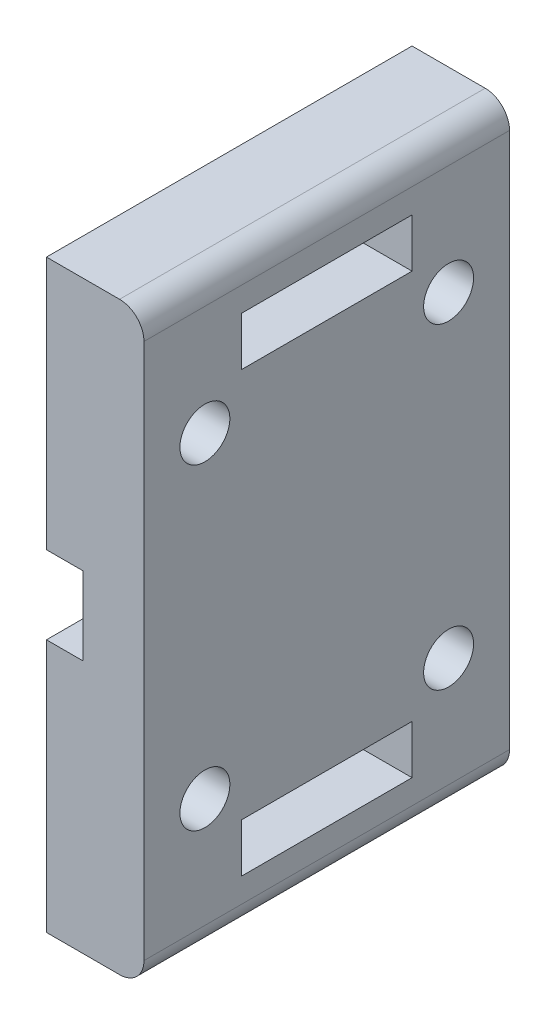
ISO-10303-21;
HEADER;
FILE_DESCRIPTION(('STEP AP214'),'2;1');
FILE_NAME('part.step','',(''),(''),'','','');
FILE_SCHEMA(('AUTOMOTIVE_DESIGN { 1 0 10303 214 1 1 1 1 }'));
ENDSEC;
DATA;
#1=APPLICATION_CONTEXT('core data for automotive mechanical design processes');
#2=APPLICATION_PROTOCOL_DEFINITION('international standard','automotive_design',2000,#1);
#3=PRODUCT_CONTEXT('',#1,'mechanical');
#4=PRODUCT('Part','Part','',(#3));
#5=PRODUCT_RELATED_PRODUCT_CATEGORY('part','',(#4));
#6=PRODUCT_DEFINITION_FORMATION('','',#4);
#7=PRODUCT_DEFINITION_CONTEXT('part definition',#1,'design');
#8=PRODUCT_DEFINITION('design','',#6,#7);
#9=PRODUCT_DEFINITION_SHAPE('','',#8);
#10=(LENGTH_UNIT() NAMED_UNIT(*) SI_UNIT(.MILLI.,.METRE.));
#11=(NAMED_UNIT(*) PLANE_ANGLE_UNIT() SI_UNIT($,.RADIAN.));
#12=(NAMED_UNIT(*) SI_UNIT($,.STERADIAN.) SOLID_ANGLE_UNIT());
#13=UNCERTAINTY_MEASURE_WITH_UNIT(LENGTH_MEASURE(1.E-05),#10,'distance_accuracy_value','');
#14=(GEOMETRIC_REPRESENTATION_CONTEXT(3) GLOBAL_UNCERTAINTY_ASSIGNED_CONTEXT((#13)) GLOBAL_UNIT_ASSIGNED_CONTEXT((#10,
#11,#12)) REPRESENTATION_CONTEXT('',''));
#15=CARTESIAN_POINT('',(0.,0.,0.));
#16=DIRECTION('',(0.,0.,1.));
#17=DIRECTION('',(1.,0.,0.));
#18=AXIS2_PLACEMENT_3D('',#15,#16,#17);
#19=CARTESIAN_POINT('',(-4.,-12.,0.));
#20=DIRECTION('',(0.,0.,-1.));
#21=DIRECTION('',(-1.,0.,0.));
#22=AXIS2_PLACEMENT_3D('',#19,#20,#21);
#23=PLANE('',#22);
#24=DIRECTION('',(1.,0.,0.));
#25=VECTOR('',#24,1.);
#26=CARTESIAN_POINT('',(-4.,-12.,0.));
#27=LINE('',#26,#25);
#28=CARTESIAN_POINT('',(-4.,-12.,0.));
#29=VERTEX_POINT('',#28);
#30=CARTESIAN_POINT('',(-1.,-12.,0.));
#31=VERTEX_POINT('',#30);
#32=EDGE_CURVE('E341',#29,#31,#27,.T.);
#33=ORIENTED_EDGE('',*,*,#32,.T.);
#34=CARTESIAN_POINT('',(-1.,-11.,0.));
#35=DIRECTION('',(0.,0.,-1.));
#36=DIRECTION('',(-1.,0.,0.));
#37=AXIS2_PLACEMENT_3D('',#34,#35,#36);
#38=CIRCLE('',#37,1.);
#39=CARTESIAN_POINT('',(0.,-11.,0.));
#40=VERTEX_POINT('',#39);
#41=EDGE_CURVE('E388',#31,#40,#38,.F.);
#42=ORIENTED_EDGE('',*,*,#41,.T.);
#43=DIRECTION('',(0.,1.,0.));
#44=VECTOR('',#43,1.);
#45=CARTESIAN_POINT('',(0.,-12.,0.));
#46=LINE('',#45,#44);
#47=CARTESIAN_POINT('',(0.,11.,0.));
#48=VERTEX_POINT('',#47);
#49=EDGE_CURVE('E323',#40,#48,#46,.T.);
#50=ORIENTED_EDGE('',*,*,#49,.T.);
#51=CARTESIAN_POINT('',(-1.,11.,0.));
#52=DIRECTION('',(0.,0.,-1.));
#53=DIRECTION('',(-1.,0.,0.));
#54=AXIS2_PLACEMENT_3D('',#51,#52,#53);
#55=CIRCLE('',#54,1.);
#56=CARTESIAN_POINT('',(-1.,12.,0.));
#57=VERTEX_POINT('',#56);
#58=EDGE_CURVE('E385',#48,#57,#55,.F.);
#59=ORIENTED_EDGE('',*,*,#58,.T.);
#60=DIRECTION('',(1.,0.,0.));
#61=VECTOR('',#60,1.);
#62=CARTESIAN_POINT('',(-4.,12.,0.));
#63=LINE('',#62,#61);
#64=CARTESIAN_POINT('',(-4.,12.,0.));
#65=VERTEX_POINT('',#64);
#66=EDGE_CURVE('E359',#65,#57,#63,.T.);
#67=ORIENTED_EDGE('',*,*,#66,.F.);
#68=DIRECTION('',(0.,1.,0.));
#69=VECTOR('',#68,1.);
#70=CARTESIAN_POINT('',(-4.,-12.,0.));
#71=LINE('',#70,#69);
#72=CARTESIAN_POINT('',(-4.,1.6,0.));
#73=VERTEX_POINT('',#72);
#74=EDGE_CURVE('E332',#73,#65,#71,.T.);
#75=ORIENTED_EDGE('',*,*,#74,.F.);
#76=DIRECTION('',(-1.,0.,0.));
#77=VECTOR('',#76,1.);
#78=CARTESIAN_POINT('',(-4.,1.6,0.));
#79=LINE('',#78,#77);
#80=CARTESIAN_POINT('',(-2.5,1.6,0.));
#81=VERTEX_POINT('',#80);
#82=EDGE_CURVE('E299',#81,#73,#79,.T.);
#83=ORIENTED_EDGE('',*,*,#82,.F.);
#84=DIRECTION('',(0.,1.,0.));
#85=VECTOR('',#84,1.);
#86=CARTESIAN_POINT('',(-2.5,1.6,0.));
#87=LINE('',#86,#85);
#88=CARTESIAN_POINT('',(-2.5,-1.6,0.));
#89=VERTEX_POINT('',#88);
#90=EDGE_CURVE('E295',#89,#81,#87,.T.);
#91=ORIENTED_EDGE('',*,*,#90,.F.);
#92=DIRECTION('',(1.,0.,0.));
#93=VECTOR('',#92,1.);
#94=CARTESIAN_POINT('',(-4.,-1.6,0.));
#95=LINE('',#94,#93);
#96=CARTESIAN_POINT('',(-4.,-1.6,0.));
#97=VERTEX_POINT('',#96);
#98=EDGE_CURVE('E291',#97,#89,#95,.T.);
#99=ORIENTED_EDGE('',*,*,#98,.F.);
#100=EDGE_CURVE('E327',#29,#97,#71,.T.);
#101=ORIENTED_EDGE('',*,*,#100,.F.);
#102=EDGE_LOOP('',(#33,#42,#50,#59,#67,#75,#83,#91,#99,#101));
#103=FACE_BOUND('',#102,.T.);
#104=ADVANCED_FACE('F49',(#103),#23,.F.);
#105=CARTESIAN_POINT('',(-4.,12.,-15.));
#106=DIRECTION('',(0.,-1.,0.));
#107=DIRECTION('',(0.,0.,-1.));
#108=AXIS2_PLACEMENT_3D('',#105,#106,#107);
#109=PLANE('',#108);
#110=ORIENTED_EDGE('',*,*,#66,.T.);
#111=DIRECTION('',(0.,0.,-1.));
#112=VECTOR('',#111,1.);
#113=CARTESIAN_POINT('',(-1.,12.,-15.));
#114=LINE('',#113,#112);
#115=CARTESIAN_POINT('',(-1.,12.,-15.));
#116=VERTEX_POINT('',#115);
#117=EDGE_CURVE('E11',#57,#116,#114,.T.);
#118=ORIENTED_EDGE('',*,*,#117,.T.);
#119=DIRECTION('',(1.,0.,0.));
#120=VECTOR('',#119,1.);
#121=CARTESIAN_POINT('',(-4.,12.,-15.));
#122=LINE('',#121,#120);
#123=CARTESIAN_POINT('',(-4.,12.,-15.));
#124=VERTEX_POINT('',#123);
#125=EDGE_CURVE('E355',#124,#116,#122,.T.);
#126=ORIENTED_EDGE('',*,*,#125,.F.);
#127=DIRECTION('',(0.,0.,-1.));
#128=VECTOR('',#127,1.);
#129=CARTESIAN_POINT('',(-4.,12.,-15.));
#130=LINE('',#129,#128);
#131=EDGE_CURVE('E331',#65,#124,#130,.T.);
#132=ORIENTED_EDGE('',*,*,#131,.F.);
#133=EDGE_LOOP('',(#110,#118,#126,#132));
#134=FACE_BOUND('',#133,.T.);
#135=ADVANCED_FACE('F417',(#134),#109,.F.);
#136=CARTESIAN_POINT('',(-4.,-12.,-15.));
#137=DIRECTION('',(0.,0.,1.));
#138=DIRECTION('',(1.,0.,0.));
#139=AXIS2_PLACEMENT_3D('',#136,#137,#138);
#140=PLANE('',#139);
#141=DIRECTION('',(0.,-1.,0.));
#142=VECTOR('',#141,1.);
#143=CARTESIAN_POINT('',(0.,-12.,-15.));
#144=LINE('',#143,#142);
#145=CARTESIAN_POINT('',(0.,11.,-15.));
#146=VERTEX_POINT('',#145);
#147=CARTESIAN_POINT('',(0.,-11.,-15.));
#148=VERTEX_POINT('',#147);
#149=EDGE_CURVE('E345',#146,#148,#144,.T.);
#150=ORIENTED_EDGE('',*,*,#149,.T.);
#151=CARTESIAN_POINT('',(-1.,-11.,-15.));
#152=DIRECTION('',(0.,0.,1.));
#153=DIRECTION('',(1.,0.,0.));
#154=AXIS2_PLACEMENT_3D('',#151,#152,#153);
#155=CIRCLE('',#154,1.);
#156=CARTESIAN_POINT('',(-1.,-12.,-15.));
#157=VERTEX_POINT('',#156);
#158=EDGE_CURVE('E58',#148,#157,#155,.F.);
#159=ORIENTED_EDGE('',*,*,#158,.T.);
#160=DIRECTION('',(1.,0.,0.));
#161=VECTOR('',#160,1.);
#162=CARTESIAN_POINT('',(-4.,-12.,-15.));
#163=LINE('',#162,#161);
#164=CARTESIAN_POINT('',(-4.,-12.,-15.));
#165=VERTEX_POINT('',#164);
#166=EDGE_CURVE('E351',#165,#157,#163,.T.);
#167=ORIENTED_EDGE('',*,*,#166,.F.);
#168=DIRECTION('',(0.,-1.,0.));
#169=VECTOR('',#168,1.);
#170=CARTESIAN_POINT('',(-4.,-12.,-15.));
#171=LINE('',#170,#169);
#172=EDGE_CURVE('E335',#124,#165,#171,.T.);
#173=ORIENTED_EDGE('',*,*,#172,.F.);
#174=ORIENTED_EDGE('',*,*,#125,.T.);
#175=CARTESIAN_POINT('',(-1.,11.,-15.));
#176=DIRECTION('',(0.,0.,1.));
#177=DIRECTION('',(1.,0.,0.));
#178=AXIS2_PLACEMENT_3D('',#175,#176,#177);
#179=CIRCLE('',#178,1.);
#180=EDGE_CURVE('E65',#116,#146,#179,.F.);
#181=ORIENTED_EDGE('',*,*,#180,.T.);
#182=EDGE_LOOP('',(#150,#159,#167,#173,#174,#181));
#183=FACE_BOUND('',#182,.T.);
#184=ADVANCED_FACE('F401',(#183),#140,.F.);
#185=CARTESIAN_POINT('',(-4.,-12.,-15.));
#186=DIRECTION('',(0.,1.,0.));
#187=DIRECTION('',(0.,0.,1.));
#188=AXIS2_PLACEMENT_3D('',#185,#186,#187);
#189=PLANE('',#188);
#190=ORIENTED_EDGE('',*,*,#166,.T.);
#191=DIRECTION('',(0.,0.,1.));
#192=VECTOR('',#191,1.);
#193=CARTESIAN_POINT('',(-1.,-12.,0.));
#194=LINE('',#193,#192);
#195=EDGE_CURVE('E363',#157,#31,#194,.T.);
#196=ORIENTED_EDGE('',*,*,#195,.T.);
#197=ORIENTED_EDGE('',*,*,#32,.F.);
#198=DIRECTION('',(0.,0.,1.));
#199=VECTOR('',#198,1.);
#200=CARTESIAN_POINT('',(-4.,-12.,-15.));
#201=LINE('',#200,#199);
#202=EDGE_CURVE('E338',#165,#29,#201,.T.);
#203=ORIENTED_EDGE('',*,*,#202,.F.);
#204=EDGE_LOOP('',(#190,#196,#197,#203));
#205=FACE_BOUND('',#204,.T.);
#206=ADVANCED_FACE('F407',(#205),#189,.F.);
#207=CARTESIAN_POINT('',(-4.,0.,0.));
#208=DIRECTION('',(1.,0.,0.));
#209=DIRECTION('',(0.,0.,-1.));
#210=AXIS2_PLACEMENT_3D('',#207,#208,#209);
#211=PLANE('',#210);
#212=CARTESIAN_POINT('',(-4.,-6.5,-12.5));
#213=DIRECTION('',(-1.,0.,0.));
#214=DIRECTION('',(0.,0.,1.));
#215=AXIS2_PLACEMENT_3D('',#212,#213,#214);
#216=CIRCLE('',#215,1.025);
#217=CARTESIAN_POINT('',(-4.,-6.5,-11.475));
#218=VERTEX_POINT('',#217);
#219=EDGE_CURVE('E381',#218,#218,#216,.T.);
#220=ORIENTED_EDGE('',*,*,#219,.F.);
#221=EDGE_LOOP('',(#220));
#222=FACE_BOUND('',#221,.T.);
#223=CARTESIAN_POINT('',(-4.,6.5,-12.5));
#224=DIRECTION('',(-1.,0.,0.));
#225=DIRECTION('',(0.,0.,1.));
#226=AXIS2_PLACEMENT_3D('',#223,#224,#225);
#227=CIRCLE('',#226,1.025);
#228=CARTESIAN_POINT('',(-4.,6.5,-11.475));
#229=VERTEX_POINT('',#228);
#230=EDGE_CURVE('E376',#229,#229,#227,.T.);
#231=ORIENTED_EDGE('',*,*,#230,.F.);
#232=EDGE_LOOP('',(#231));
#233=FACE_BOUND('',#232,.T.);
#234=CARTESIAN_POINT('',(-4.,6.5,-2.5));
#235=DIRECTION('',(-1.,0.,0.));
#236=DIRECTION('',(0.,0.,1.));
#237=AXIS2_PLACEMENT_3D('',#234,#235,#236);
#238=CIRCLE('',#237,1.025);
#239=CARTESIAN_POINT('',(-4.,6.5,-1.475));
#240=VERTEX_POINT('',#239);
#241=EDGE_CURVE('E371',#240,#240,#238,.T.);
#242=ORIENTED_EDGE('',*,*,#241,.F.);
#243=EDGE_LOOP('',(#242));
#244=FACE_BOUND('',#243,.T.);
#245=CARTESIAN_POINT('',(-4.,-6.5,-2.5));
#246=DIRECTION('',(-1.,0.,0.));
#247=DIRECTION('',(0.,0.,1.));
#248=AXIS2_PLACEMENT_3D('',#245,#246,#247);
#249=CIRCLE('',#248,1.025);
#250=CARTESIAN_POINT('',(-4.,-6.5,-1.475));
#251=VERTEX_POINT('',#250);
#252=EDGE_CURVE('E212',#251,#251,#249,.T.);
#253=ORIENTED_EDGE('',*,*,#252,.F.);
#254=EDGE_LOOP('',(#253));
#255=FACE_BOUND('',#254,.T.);
#256=DIRECTION('',(0.,0.,1.));
#257=VECTOR('',#256,1.);
#258=CARTESIAN_POINT('',(-4.,-10.,-11.));
#259=LINE('',#258,#257);
#260=CARTESIAN_POINT('',(-4.,-10.,-11.));
#261=VERTEX_POINT('',#260);
#262=CARTESIAN_POINT('',(-4.,-10.,-4.));
#263=VERTEX_POINT('',#262);
#264=EDGE_CURVE('E221',#261,#263,#259,.T.);
#265=ORIENTED_EDGE('',*,*,#264,.F.);
#266=DIRECTION('',(0.,-1.,0.));
#267=VECTOR('',#266,1.);
#268=CARTESIAN_POINT('',(-4.,-8.,-11.));
#269=LINE('',#268,#267);
#270=CARTESIAN_POINT('',(-4.,-8.,-11.));
#271=VERTEX_POINT('',#270);
#272=EDGE_CURVE('E184',#271,#261,#269,.T.);
#273=ORIENTED_EDGE('',*,*,#272,.F.);
#274=DIRECTION('',(0.,0.,-1.));
#275=VECTOR('',#274,1.);
#276=CARTESIAN_POINT('',(-4.,-8.,-11.));
#277=LINE('',#276,#275);
#278=CARTESIAN_POINT('',(-4.,-8.,-4.));
#279=VERTEX_POINT('',#278);
#280=EDGE_CURVE('E205',#279,#271,#277,.T.);
#281=ORIENTED_EDGE('',*,*,#280,.F.);
#282=DIRECTION('',(0.,1.,0.));
#283=VECTOR('',#282,1.);
#284=CARTESIAN_POINT('',(-4.,-8.,-4.));
#285=LINE('',#284,#283);
#286=EDGE_CURVE('E209',#263,#279,#285,.T.);
#287=ORIENTED_EDGE('',*,*,#286,.F.);
#288=EDGE_LOOP('',(#265,#273,#281,#287));
#289=FACE_BOUND('',#288,.T.);
#290=DIRECTION('',(0.,0.,1.));
#291=VECTOR('',#290,1.);
#292=CARTESIAN_POINT('',(-4.,8.,-11.));
#293=LINE('',#292,#291);
#294=CARTESIAN_POINT('',(-4.,8.,-11.));
#295=VERTEX_POINT('',#294);
#296=CARTESIAN_POINT('',(-4.,8.,-4.));
#297=VERTEX_POINT('',#296);
#298=EDGE_CURVE('E261',#295,#297,#293,.T.);
#299=ORIENTED_EDGE('',*,*,#298,.F.);
#300=DIRECTION('',(0.,-1.,0.));
#301=VECTOR('',#300,1.);
#302=CARTESIAN_POINT('',(-4.,10.,-11.));
#303=LINE('',#302,#301);
#304=CARTESIAN_POINT('',(-4.,10.,-11.));
#305=VERTEX_POINT('',#304);
#306=EDGE_CURVE('E222',#305,#295,#303,.T.);
#307=ORIENTED_EDGE('',*,*,#306,.F.);
#308=DIRECTION('',(0.,0.,-1.));
#309=VECTOR('',#308,1.);
#310=CARTESIAN_POINT('',(-4.,10.,-11.));
#311=LINE('',#310,#309);
#312=CARTESIAN_POINT('',(-4.,10.,-4.));
#313=VERTEX_POINT('',#312);
#314=EDGE_CURVE('E252',#313,#305,#311,.T.);
#315=ORIENTED_EDGE('',*,*,#314,.F.);
#316=DIRECTION('',(0.,1.,0.));
#317=VECTOR('',#316,1.);
#318=CARTESIAN_POINT('',(-4.,10.,-4.));
#319=LINE('',#318,#317);
#320=EDGE_CURVE('E256',#297,#313,#319,.T.);
#321=ORIENTED_EDGE('',*,*,#320,.F.);
#322=EDGE_LOOP('',(#299,#307,#315,#321));
#323=FACE_BOUND('',#322,.T.);
#324=CARTESIAN_POINT('',(-4.,0.,-7.5));
#325=DIRECTION('',(-1.,0.,0.));
#326=DIRECTION('',(0.,0.,1.));
#327=AXIS2_PLACEMENT_3D('',#324,#325,#326);
#328=CIRCLE('',#327,5.25);
#329=CARTESIAN_POINT('',(-4.,1.6,-2.49975000624969));
#330=VERTEX_POINT('',#329);
#331=CARTESIAN_POINT('',(-4.,-1.6,-2.49975000624969));
#332=VERTEX_POINT('',#331);
#333=EDGE_CURVE('E318',#330,#332,#328,.T.);
#334=ORIENTED_EDGE('',*,*,#333,.F.);
#335=DIRECTION('',(0.,0.,1.));
#336=VECTOR('',#335,1.);
#337=CARTESIAN_POINT('',(-4.,1.6,-15.001));
#338=LINE('',#337,#336);
#339=EDGE_CURVE('E303',#330,#73,#338,.T.);
#340=ORIENTED_EDGE('',*,*,#339,.T.);
#341=ORIENTED_EDGE('',*,*,#74,.T.);
#342=ORIENTED_EDGE('',*,*,#131,.T.);
#343=ORIENTED_EDGE('',*,*,#172,.T.);
#344=ORIENTED_EDGE('',*,*,#202,.T.);
#345=ORIENTED_EDGE('',*,*,#100,.T.);
#346=DIRECTION('',(0.,0.,1.));
#347=VECTOR('',#346,1.);
#348=CARTESIAN_POINT('',(-4.,-1.6,-15.001));
#349=LINE('',#348,#347);
#350=EDGE_CURVE('E302',#332,#97,#349,.T.);
#351=ORIENTED_EDGE('',*,*,#350,.F.);
#352=EDGE_LOOP('',(#334,#340,#341,#342,#343,#344,#345,#351));
#353=FACE_BOUND('',#352,.T.);
#354=ADVANCED_FACE('F421',(#222,#233,#244,#255,#289,#323,#353),#211,.F.);
#355=CARTESIAN_POINT('',(0.,0.,0.));
#356=DIRECTION('',(1.,0.,0.));
#357=DIRECTION('',(0.,0.,-1.));
#358=AXIS2_PLACEMENT_3D('',#355,#356,#357);
#359=PLANE('',#358);
#360=CARTESIAN_POINT('',(0.,-6.5,-12.5));
#361=DIRECTION('',(1.,0.,0.));
#362=DIRECTION('',(0.,0.,-1.));
#363=AXIS2_PLACEMENT_3D('',#360,#361,#362);
#364=CIRCLE('',#363,1.025);
#365=CARTESIAN_POINT('',(0.,-6.5,-13.525));
#366=VERTEX_POINT('',#365);
#367=EDGE_CURVE('E377',#366,#366,#364,.T.);
#368=ORIENTED_EDGE('',*,*,#367,.F.);
#369=EDGE_LOOP('',(#368));
#370=FACE_BOUND('',#369,.T.);
#371=CARTESIAN_POINT('',(0.,6.5,-12.5));
#372=DIRECTION('',(1.,0.,0.));
#373=DIRECTION('',(0.,0.,-1.));
#374=AXIS2_PLACEMENT_3D('',#371,#372,#373);
#375=CIRCLE('',#374,1.025);
#376=CARTESIAN_POINT('',(0.,6.5,-13.525));
#377=VERTEX_POINT('',#376);
#378=EDGE_CURVE('E372',#377,#377,#375,.T.);
#379=ORIENTED_EDGE('',*,*,#378,.F.);
#380=EDGE_LOOP('',(#379));
#381=FACE_BOUND('',#380,.T.);
#382=CARTESIAN_POINT('',(0.,6.5,-2.5));
#383=DIRECTION('',(1.,0.,0.));
#384=DIRECTION('',(0.,0.,-1.));
#385=AXIS2_PLACEMENT_3D('',#382,#383,#384);
#386=CIRCLE('',#385,1.025);
#387=CARTESIAN_POINT('',(0.,6.5,-3.525));
#388=VERTEX_POINT('',#387);
#389=EDGE_CURVE('E367',#388,#388,#386,.T.);
#390=ORIENTED_EDGE('',*,*,#389,.F.);
#391=EDGE_LOOP('',(#390));
#392=FACE_BOUND('',#391,.T.);
#393=CARTESIAN_POINT('',(0.,-6.5,-2.5));
#394=DIRECTION('',(1.,0.,0.));
#395=DIRECTION('',(0.,0.,-1.));
#396=AXIS2_PLACEMENT_3D('',#393,#394,#395);
#397=CIRCLE('',#396,1.025);
#398=CARTESIAN_POINT('',(0.,-6.5,-3.525));
#399=VERTEX_POINT('',#398);
#400=EDGE_CURVE('E251',#399,#399,#397,.T.);
#401=ORIENTED_EDGE('',*,*,#400,.F.);
#402=EDGE_LOOP('',(#401));
#403=FACE_BOUND('',#402,.T.);
#404=DIRECTION('',(0.,-1.,0.));
#405=VECTOR('',#404,1.);
#406=CARTESIAN_POINT('',(0.,-8.,-11.));
#407=LINE('',#406,#405);
#408=CARTESIAN_POINT('',(0.,-8.,-11.));
#409=VERTEX_POINT('',#408);
#410=CARTESIAN_POINT('',(0.,-10.,-11.));
#411=VERTEX_POINT('',#410);
#412=EDGE_CURVE('E181',#409,#411,#407,.T.);
#413=ORIENTED_EDGE('',*,*,#412,.T.);
#414=DIRECTION('',(0.,0.,1.));
#415=VECTOR('',#414,1.);
#416=CARTESIAN_POINT('',(0.,-10.,-11.));
#417=LINE('',#416,#415);
#418=CARTESIAN_POINT('',(0.,-10.,-4.));
#419=VERTEX_POINT('',#418);
#420=EDGE_CURVE('E194',#411,#419,#417,.T.);
#421=ORIENTED_EDGE('',*,*,#420,.T.);
#422=DIRECTION('',(0.,1.,0.));
#423=VECTOR('',#422,1.);
#424=CARTESIAN_POINT('',(0.,-8.,-4.));
#425=LINE('',#424,#423);
#426=CARTESIAN_POINT('',(0.,-8.,-4.));
#427=VERTEX_POINT('',#426);
#428=EDGE_CURVE('E199',#419,#427,#425,.T.);
#429=ORIENTED_EDGE('',*,*,#428,.T.);
#430=DIRECTION('',(0.,0.,-1.));
#431=VECTOR('',#430,1.);
#432=CARTESIAN_POINT('',(0.,-8.,-11.));
#433=LINE('',#432,#431);
#434=EDGE_CURVE('E190',#427,#409,#433,.T.);
#435=ORIENTED_EDGE('',*,*,#434,.T.);
#436=EDGE_LOOP('',(#413,#421,#429,#435));
#437=FACE_BOUND('',#436,.T.);
#438=DIRECTION('',(0.,-1.,0.));
#439=VECTOR('',#438,1.);
#440=CARTESIAN_POINT('',(0.,10.,-11.));
#441=LINE('',#440,#439);
#442=CARTESIAN_POINT('',(0.,10.,-11.));
#443=VERTEX_POINT('',#442);
#444=CARTESIAN_POINT('',(0.,8.,-11.));
#445=VERTEX_POINT('',#444);
#446=EDGE_CURVE('E257',#443,#445,#441,.T.);
#447=ORIENTED_EDGE('',*,*,#446,.T.);
#448=DIRECTION('',(0.,0.,1.));
#449=VECTOR('',#448,1.);
#450=CARTESIAN_POINT('',(0.,8.,-11.));
#451=LINE('',#450,#449);
#452=CARTESIAN_POINT('',(0.,8.,-4.));
#453=VERTEX_POINT('',#452);
#454=EDGE_CURVE('E274',#445,#453,#451,.T.);
#455=ORIENTED_EDGE('',*,*,#454,.T.);
#456=DIRECTION('',(0.,1.,0.));
#457=VECTOR('',#456,1.);
#458=CARTESIAN_POINT('',(0.,10.,-4.));
#459=LINE('',#458,#457);
#460=CARTESIAN_POINT('',(0.,10.,-4.));
#461=VERTEX_POINT('',#460);
#462=EDGE_CURVE('E270',#453,#461,#459,.T.);
#463=ORIENTED_EDGE('',*,*,#462,.T.);
#464=DIRECTION('',(0.,0.,-1.));
#465=VECTOR('',#464,1.);
#466=CARTESIAN_POINT('',(0.,10.,-11.));
#467=LINE('',#466,#465);
#468=EDGE_CURVE('E241',#461,#443,#467,.T.);
#469=ORIENTED_EDGE('',*,*,#468,.T.);
#470=EDGE_LOOP('',(#447,#455,#463,#469));
#471=FACE_BOUND('',#470,.T.);
#472=ORIENTED_EDGE('',*,*,#49,.F.);
#473=DIRECTION('',(0.,0.,1.));
#474=VECTOR('',#473,1.);
#475=CARTESIAN_POINT('',(0.,-11.,-15.));
#476=LINE('',#475,#474);
#477=EDGE_CURVE('E72',#40,#148,#476,.F.);
#478=ORIENTED_EDGE('',*,*,#477,.T.);
#479=ORIENTED_EDGE('',*,*,#149,.F.);
#480=DIRECTION('',(0.,0.,-1.));
#481=VECTOR('',#480,1.);
#482=CARTESIAN_POINT('',(0.,11.,0.));
#483=LINE('',#482,#481);
#484=EDGE_CURVE('E391',#146,#48,#483,.F.);
#485=ORIENTED_EDGE('',*,*,#484,.T.);
#486=EDGE_LOOP('',(#472,#478,#479,#485));
#487=FACE_BOUND('',#486,.T.);
#488=ADVANCED_FACE('F201',(#370,#381,#392,#403,#437,#471,#487),#359,.T.);
#489=CARTESIAN_POINT('',(-2.5,0.,-7.5));
#490=DIRECTION('',(-1.,0.,0.));
#491=DIRECTION('',(0.,0.,1.));
#492=AXIS2_PLACEMENT_3D('',#489,#490,#491);
#493=CYLINDRICAL_SURFACE('',#492,5.25);
#494=CARTESIAN_POINT('',(-2.5,0.,-7.5));
#495=DIRECTION('',(-1.,0.,0.));
#496=DIRECTION('',(0.,0.,1.));
#497=AXIS2_PLACEMENT_3D('',#494,#495,#496);
#498=CIRCLE('',#497,5.25);
#499=CARTESIAN_POINT('',(-2.5,1.6,-2.49975000624969));
#500=VERTEX_POINT('',#499);
#501=CARTESIAN_POINT('',(-2.5,-1.6,-2.49975000624969));
#502=VERTEX_POINT('',#501);
#503=EDGE_CURVE('E319',#500,#502,#498,.T.);
#504=ORIENTED_EDGE('',*,*,#503,.F.);
#505=DIRECTION('',(-1.,0.,0.));
#506=VECTOR('',#505,1.);
#507=CARTESIAN_POINT('',(-2.5,1.6,-2.49975000624969));
#508=LINE('',#507,#506);
#509=EDGE_CURVE('E285',#330,#500,#508,.F.);
#510=ORIENTED_EDGE('',*,*,#509,.F.);
#511=ORIENTED_EDGE('',*,*,#333,.T.);
#512=DIRECTION('',(-1.,0.,0.));
#513=VECTOR('',#512,1.);
#514=CARTESIAN_POINT('',(-2.5,-1.6,-2.49975000624969));
#515=LINE('',#514,#513);
#516=EDGE_CURVE('E307',#502,#332,#515,.T.);
#517=ORIENTED_EDGE('',*,*,#516,.F.);
#518=EDGE_LOOP('',(#504,#510,#511,#517));
#519=FACE_BOUND('',#518,.T.);
#520=ADVANCED_FACE('F438',(#519),#493,.F.);
#521=CARTESIAN_POINT('',(-2.5,0.,-7.5));
#522=DIRECTION('',(-1.,0.,0.));
#523=DIRECTION('',(0.,0.,1.));
#524=AXIS2_PLACEMENT_3D('',#521,#522,#523);
#525=PLANE('',#524);
#526=CARTESIAN_POINT('',(-2.5,0.,-7.5));
#527=DIRECTION('',(-1.,0.,0.));
#528=DIRECTION('',(0.,0.,1.));
#529=AXIS2_PLACEMENT_3D('',#526,#527,#528);
#530=CIRCLE('',#529,0.800000000000001);
#531=CARTESIAN_POINT('',(-2.5,0.,-6.7));
#532=VERTEX_POINT('',#531);
#533=EDGE_CURVE('E231',#532,#532,#530,.T.);
#534=ORIENTED_EDGE('',*,*,#533,.F.);
#535=EDGE_LOOP('',(#534));
#536=FACE_BOUND('',#535,.T.);
#537=ORIENTED_EDGE('',*,*,#503,.T.);
#538=DIRECTION('',(0.,0.,1.));
#539=VECTOR('',#538,1.);
#540=CARTESIAN_POINT('',(-2.5,-1.6,-15.001));
#541=LINE('',#540,#539);
#542=EDGE_CURVE('E311',#502,#89,#541,.T.);
#543=ORIENTED_EDGE('',*,*,#542,.T.);
#544=ORIENTED_EDGE('',*,*,#90,.T.);
#545=DIRECTION('',(0.,0.,1.));
#546=VECTOR('',#545,1.);
#547=CARTESIAN_POINT('',(-2.5,1.6,-15.001));
#548=LINE('',#547,#546);
#549=EDGE_CURVE('E308',#500,#81,#548,.T.);
#550=ORIENTED_EDGE('',*,*,#549,.F.);
#551=EDGE_LOOP('',(#537,#543,#544,#550));
#552=FACE_BOUND('',#551,.T.);
#553=ADVANCED_FACE('F432',(#536,#552),#525,.T.);
#554=CARTESIAN_POINT('',(-4.,1.6,-15.001));
#555=DIRECTION('',(0.,1.,0.));
#556=DIRECTION('',(0.,0.,1.));
#557=AXIS2_PLACEMENT_3D('',#554,#555,#556);
#558=PLANE('',#557);
#559=ORIENTED_EDGE('',*,*,#509,.T.);
#560=ORIENTED_EDGE('',*,*,#549,.T.);
#561=ORIENTED_EDGE('',*,*,#82,.T.);
#562=ORIENTED_EDGE('',*,*,#339,.F.);
#563=EDGE_LOOP('',(#559,#560,#561,#562));
#564=FACE_BOUND('',#563,.T.);
#565=ADVANCED_FACE('F427',(#564),#558,.F.);
#566=CARTESIAN_POINT('',(-4.,-1.6,-15.001));
#567=DIRECTION('',(0.,-1.,0.));
#568=DIRECTION('',(0.,0.,-1.));
#569=AXIS2_PLACEMENT_3D('',#566,#567,#568);
#570=PLANE('',#569);
#571=ORIENTED_EDGE('',*,*,#516,.T.);
#572=ORIENTED_EDGE('',*,*,#350,.T.);
#573=ORIENTED_EDGE('',*,*,#98,.T.);
#574=ORIENTED_EDGE('',*,*,#542,.F.);
#575=EDGE_LOOP('',(#571,#572,#573,#574));
#576=FACE_BOUND('',#575,.T.);
#577=ADVANCED_FACE('F435',(#576),#570,.F.);
#578=CARTESIAN_POINT('',(-1.3,0.,-7.5));
#579=DIRECTION('',(-1.,0.,0.));
#580=DIRECTION('',(0.,0.,1.));
#581=AXIS2_PLACEMENT_3D('',#578,#579,#580);
#582=CYLINDRICAL_SURFACE('',#581,0.800000000000001);
#583=CARTESIAN_POINT('',(-1.3,0.,-7.5));
#584=DIRECTION('',(-1.,0.,0.));
#585=DIRECTION('',(0.,0.,1.));
#586=AXIS2_PLACEMENT_3D('',#583,#584,#585);
#587=CIRCLE('',#586,0.800000000000001);
#588=CARTESIAN_POINT('',(-1.3,0.,-6.7));
#589=VERTEX_POINT('',#588);
#590=EDGE_CURVE('E281',#589,#589,#587,.T.);
#591=ORIENTED_EDGE('',*,*,#590,.F.);
#592=EDGE_LOOP('',(#591));
#593=FACE_BOUND('',#592,.T.);
#594=ORIENTED_EDGE('',*,*,#533,.T.);
#595=EDGE_LOOP('',(#594));
#596=FACE_BOUND('',#595,.T.);
#597=ADVANCED_FACE('F514',(#593,#596),#582,.F.);
#598=CARTESIAN_POINT('',(-1.3,0.,-7.5));
#599=DIRECTION('',(-1.,0.,0.));
#600=DIRECTION('',(0.,0.,1.));
#601=AXIS2_PLACEMENT_3D('',#598,#599,#600);
#602=PLANE('',#601);
#603=ORIENTED_EDGE('',*,*,#590,.T.);
#604=EDGE_LOOP('',(#603));
#605=FACE_BOUND('',#604,.T.);
#606=ADVANCED_FACE('F500',(#605),#602,.T.);
#607=CARTESIAN_POINT('',(0.,10.,-11.));
#608=DIRECTION('',(0.,0.,-1.));
#609=DIRECTION('',(-1.,0.,0.));
#610=AXIS2_PLACEMENT_3D('',#607,#608,#609);
#611=PLANE('',#610);
#612=ORIENTED_EDGE('',*,*,#306,.T.);
#613=DIRECTION('',(-1.,0.,0.));
#614=VECTOR('',#613,1.);
#615=CARTESIAN_POINT('',(0.,8.,-11.));
#616=LINE('',#615,#614);
#617=EDGE_CURVE('E237',#445,#295,#616,.T.);
#618=ORIENTED_EDGE('',*,*,#617,.F.);
#619=ORIENTED_EDGE('',*,*,#446,.F.);
#620=DIRECTION('',(-1.,0.,0.));
#621=VECTOR('',#620,1.);
#622=CARTESIAN_POINT('',(0.,10.,-11.));
#623=LINE('',#622,#621);
#624=EDGE_CURVE('E248',#443,#305,#623,.T.);
#625=ORIENTED_EDGE('',*,*,#624,.T.);
#626=EDGE_LOOP('',(#612,#618,#619,#625));
#627=FACE_BOUND('',#626,.T.);
#628=ADVANCED_FACE('F496',(#627),#611,.F.);
#629=CARTESIAN_POINT('',(0.,10.,-11.));
#630=DIRECTION('',(0.,1.,0.));
#631=DIRECTION('',(0.,0.,1.));
#632=AXIS2_PLACEMENT_3D('',#629,#630,#631);
#633=PLANE('',#632);
#634=ORIENTED_EDGE('',*,*,#314,.T.);
#635=ORIENTED_EDGE('',*,*,#624,.F.);
#636=ORIENTED_EDGE('',*,*,#468,.F.);
#637=DIRECTION('',(-1.,0.,0.));
#638=VECTOR('',#637,1.);
#639=CARTESIAN_POINT('',(0.,10.,-4.));
#640=LINE('',#639,#638);
#641=EDGE_CURVE('E245',#461,#313,#640,.T.);
#642=ORIENTED_EDGE('',*,*,#641,.T.);
#643=EDGE_LOOP('',(#634,#635,#636,#642));
#644=FACE_BOUND('',#643,.T.);
#645=ADVANCED_FACE('F499',(#644),#633,.F.);
#646=CARTESIAN_POINT('',(0.,10.,-4.));
#647=DIRECTION('',(0.,0.,1.));
#648=DIRECTION('',(1.,0.,0.));
#649=AXIS2_PLACEMENT_3D('',#646,#647,#648);
#650=PLANE('',#649);
#651=ORIENTED_EDGE('',*,*,#320,.T.);
#652=ORIENTED_EDGE('',*,*,#641,.F.);
#653=ORIENTED_EDGE('',*,*,#462,.F.);
#654=DIRECTION('',(-1.,0.,0.));
#655=VECTOR('',#654,1.);
#656=CARTESIAN_POINT('',(0.,8.,-4.));
#657=LINE('',#656,#655);
#658=EDGE_CURVE('E242',#453,#297,#657,.T.);
#659=ORIENTED_EDGE('',*,*,#658,.T.);
#660=EDGE_LOOP('',(#651,#652,#653,#659));
#661=FACE_BOUND('',#660,.T.);
#662=ADVANCED_FACE('F504',(#661),#650,.F.);
#663=CARTESIAN_POINT('',(0.,8.,-11.));
#664=DIRECTION('',(0.,-1.,0.));
#665=DIRECTION('',(0.,0.,-1.));
#666=AXIS2_PLACEMENT_3D('',#663,#664,#665);
#667=PLANE('',#666);
#668=ORIENTED_EDGE('',*,*,#298,.T.);
#669=ORIENTED_EDGE('',*,*,#658,.F.);
#670=ORIENTED_EDGE('',*,*,#454,.F.);
#671=ORIENTED_EDGE('',*,*,#617,.T.);
#672=EDGE_LOOP('',(#668,#669,#670,#671));
#673=FACE_BOUND('',#672,.T.);
#674=ADVANCED_FACE('F495',(#673),#667,.F.);
#675=CARTESIAN_POINT('',(0.,-8.,-11.));
#676=DIRECTION('',(0.,0.,-1.));
#677=DIRECTION('',(-1.,0.,0.));
#678=AXIS2_PLACEMENT_3D('',#675,#676,#677);
#679=PLANE('',#678);
#680=ORIENTED_EDGE('',*,*,#272,.T.);
#681=DIRECTION('',(-1.,0.,0.));
#682=VECTOR('',#681,1.);
#683=CARTESIAN_POINT('',(0.,-10.,-11.));
#684=LINE('',#683,#682);
#685=EDGE_CURVE('E177',#411,#261,#684,.T.);
#686=ORIENTED_EDGE('',*,*,#685,.F.);
#687=ORIENTED_EDGE('',*,*,#412,.F.);
#688=DIRECTION('',(-1.,0.,0.));
#689=VECTOR('',#688,1.);
#690=CARTESIAN_POINT('',(0.,-8.,-11.));
#691=LINE('',#690,#689);
#692=EDGE_CURVE('E228',#409,#271,#691,.T.);
#693=ORIENTED_EDGE('',*,*,#692,.T.);
#694=EDGE_LOOP('',(#680,#686,#687,#693));
#695=FACE_BOUND('',#694,.T.);
#696=ADVANCED_FACE('F179',(#695),#679,.F.);
#697=CARTESIAN_POINT('',(0.,-8.,-11.));
#698=DIRECTION('',(0.,1.,0.));
#699=DIRECTION('',(0.,0.,1.));
#700=AXIS2_PLACEMENT_3D('',#697,#698,#699);
#701=PLANE('',#700);
#702=ORIENTED_EDGE('',*,*,#280,.T.);
#703=ORIENTED_EDGE('',*,*,#692,.F.);
#704=ORIENTED_EDGE('',*,*,#434,.F.);
#705=DIRECTION('',(-1.,0.,0.));
#706=VECTOR('',#705,1.);
#707=CARTESIAN_POINT('',(0.,-8.,-4.));
#708=LINE('',#707,#706);
#709=EDGE_CURVE('E232',#427,#279,#708,.T.);
#710=ORIENTED_EDGE('',*,*,#709,.T.);
#711=EDGE_LOOP('',(#702,#703,#704,#710));
#712=FACE_BOUND('',#711,.T.);
#713=ADVANCED_FACE('F483',(#712),#701,.F.);
#714=CARTESIAN_POINT('',(0.,-8.,-4.));
#715=DIRECTION('',(0.,0.,1.));
#716=DIRECTION('',(1.,0.,0.));
#717=AXIS2_PLACEMENT_3D('',#714,#715,#716);
#718=PLANE('',#717);
#719=ORIENTED_EDGE('',*,*,#286,.T.);
#720=ORIENTED_EDGE('',*,*,#709,.F.);
#721=ORIENTED_EDGE('',*,*,#428,.F.);
#722=DIRECTION('',(-1.,0.,0.));
#723=VECTOR('',#722,1.);
#724=CARTESIAN_POINT('',(0.,-10.,-4.));
#725=LINE('',#724,#723);
#726=EDGE_CURVE('E189',#419,#263,#725,.T.);
#727=ORIENTED_EDGE('',*,*,#726,.T.);
#728=EDGE_LOOP('',(#719,#720,#721,#727));
#729=FACE_BOUND('',#728,.T.);
#730=ADVANCED_FACE('F486',(#729),#718,.F.);
#731=CARTESIAN_POINT('',(0.,-10.,-11.));
#732=DIRECTION('',(0.,-1.,0.));
#733=DIRECTION('',(0.,0.,-1.));
#734=AXIS2_PLACEMENT_3D('',#731,#732,#733);
#735=PLANE('',#734);
#736=ORIENTED_EDGE('',*,*,#264,.T.);
#737=ORIENTED_EDGE('',*,*,#726,.F.);
#738=ORIENTED_EDGE('',*,*,#420,.F.);
#739=ORIENTED_EDGE('',*,*,#685,.T.);
#740=EDGE_LOOP('',(#736,#737,#738,#739));
#741=FACE_BOUND('',#740,.T.);
#742=ADVANCED_FACE('F195',(#741),#735,.F.);
#743=CARTESIAN_POINT('',(-4.,-6.5,-2.5));
#744=DIRECTION('',(-1.,0.,0.));
#745=DIRECTION('',(0.,0.,1.));
#746=AXIS2_PLACEMENT_3D('',#743,#744,#745);
#747=CYLINDRICAL_SURFACE('',#746,1.025);
#748=ORIENTED_EDGE('',*,*,#400,.T.);
#749=EDGE_LOOP('',(#748));
#750=FACE_BOUND('',#749,.T.);
#751=ORIENTED_EDGE('',*,*,#252,.T.);
#752=EDGE_LOOP('',(#751));
#753=FACE_BOUND('',#752,.T.);
#754=ADVANCED_FACE('F479',(#750,#753),#747,.F.);
#755=CARTESIAN_POINT('',(-4.,6.5,-2.5));
#756=DIRECTION('',(-1.,0.,0.));
#757=DIRECTION('',(0.,0.,1.));
#758=AXIS2_PLACEMENT_3D('',#755,#756,#757);
#759=CYLINDRICAL_SURFACE('',#758,1.025);
#760=ORIENTED_EDGE('',*,*,#389,.T.);
#761=EDGE_LOOP('',(#760));
#762=FACE_BOUND('',#761,.T.);
#763=ORIENTED_EDGE('',*,*,#241,.T.);
#764=EDGE_LOOP('',(#763));
#765=FACE_BOUND('',#764,.T.);
#766=ADVANCED_FACE('F472',(#762,#765),#759,.F.);
#767=CARTESIAN_POINT('',(-4.,6.5,-12.5));
#768=DIRECTION('',(-1.,0.,0.));
#769=DIRECTION('',(0.,0.,1.));
#770=AXIS2_PLACEMENT_3D('',#767,#768,#769);
#771=CYLINDRICAL_SURFACE('',#770,1.025);
#772=ORIENTED_EDGE('',*,*,#378,.T.);
#773=EDGE_LOOP('',(#772));
#774=FACE_BOUND('',#773,.T.);
#775=ORIENTED_EDGE('',*,*,#230,.T.);
#776=EDGE_LOOP('',(#775));
#777=FACE_BOUND('',#776,.T.);
#778=ADVANCED_FACE('F465',(#774,#777),#771,.F.);
#779=CARTESIAN_POINT('',(-4.,-6.5,-12.5));
#780=DIRECTION('',(-1.,0.,0.));
#781=DIRECTION('',(0.,0.,1.));
#782=AXIS2_PLACEMENT_3D('',#779,#780,#781);
#783=CYLINDRICAL_SURFACE('',#782,1.025);
#784=ORIENTED_EDGE('',*,*,#367,.T.);
#785=EDGE_LOOP('',(#784));
#786=FACE_BOUND('',#785,.T.);
#787=ORIENTED_EDGE('',*,*,#219,.T.);
#788=EDGE_LOOP('',(#787));
#789=FACE_BOUND('',#788,.T.);
#790=ADVANCED_FACE('F460',(#786,#789),#783,.F.);
#791=CARTESIAN_POINT('',(-1.,-11.,-15.));
#792=DIRECTION('',(0.,0.,-1.));
#793=DIRECTION('',(-1.,0.,0.));
#794=AXIS2_PLACEMENT_3D('',#791,#792,#793);
#795=CYLINDRICAL_SURFACE('',#794,1.);
#796=ORIENTED_EDGE('',*,*,#158,.F.);
#797=ORIENTED_EDGE('',*,*,#477,.F.);
#798=ORIENTED_EDGE('',*,*,#41,.F.);
#799=ORIENTED_EDGE('',*,*,#195,.F.);
#800=EDGE_LOOP('',(#796,#797,#798,#799));
#801=FACE_BOUND('',#800,.T.);
#802=ADVANCED_FACE('F409',(#801),#795,.T.);
#803=CARTESIAN_POINT('',(-1.,11.,-15.));
#804=DIRECTION('',(0.,0.,1.));
#805=DIRECTION('',(1.,0.,0.));
#806=AXIS2_PLACEMENT_3D('',#803,#804,#805);
#807=CYLINDRICAL_SURFACE('',#806,1.);
#808=ORIENTED_EDGE('',*,*,#58,.F.);
#809=ORIENTED_EDGE('',*,*,#484,.F.);
#810=ORIENTED_EDGE('',*,*,#180,.F.);
#811=ORIENTED_EDGE('',*,*,#117,.F.);
#812=EDGE_LOOP('',(#808,#809,#810,#811));
#813=FACE_BOUND('',#812,.T.);
#814=ADVANCED_FACE('F51',(#813),#807,.T.);
#815=CLOSED_SHELL('',(#104,#135,#184,#206,#354,#488,#520,#553,#565,#577,#597,#606,#628,#645,
#662,#674,#696,#713,#730,#742,#754,#766,#778,#790,#802,#814));
#816=MANIFOLD_SOLID_BREP('B2',#815);
#817=ADVANCED_BREP_SHAPE_REPRESENTATION('',(#18,#816),#14);
#818=SHAPE_DEFINITION_REPRESENTATION(#9,#817);
ENDSEC;
END-ISO-10303-21;
